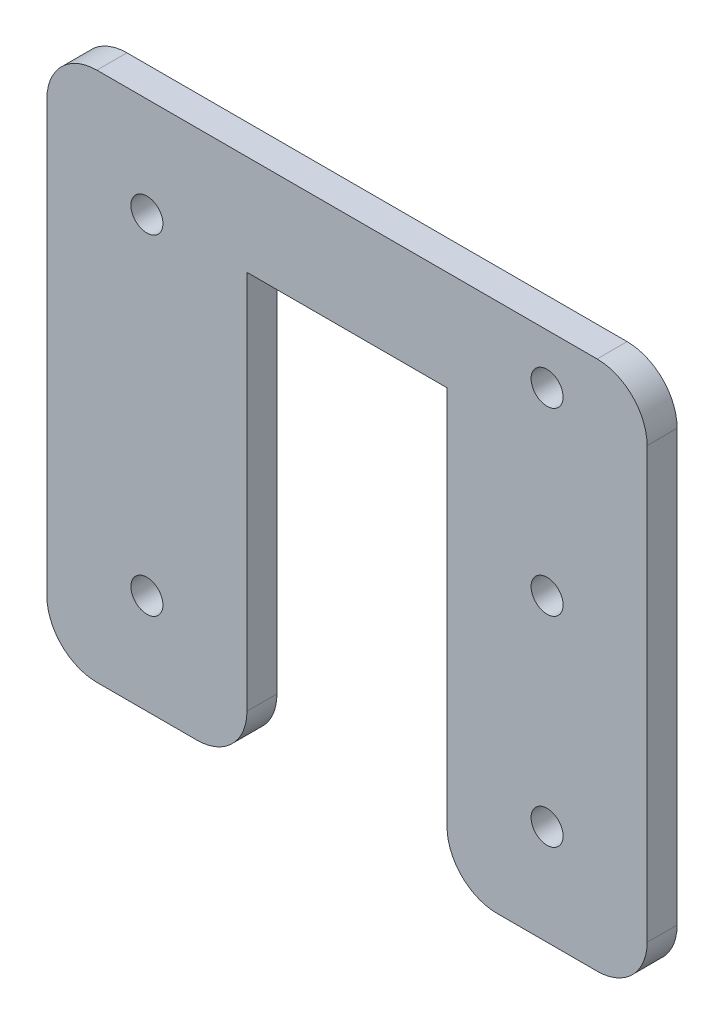
ISO-10303-21;
HEADER;
FILE_DESCRIPTION(('STEP AP214'),'2;1');
FILE_NAME('part.step','',(''),(''),'','','');
FILE_SCHEMA(('AUTOMOTIVE_DESIGN { 1 0 10303 214 1 1 1 1 }'));
ENDSEC;
DATA;
#1=APPLICATION_CONTEXT('core data for automotive mechanical design processes');
#2=APPLICATION_PROTOCOL_DEFINITION('international standard','automotive_design',2000,#1);
#3=PRODUCT_CONTEXT('',#1,'mechanical');
#4=PRODUCT('Part','Part','',(#3));
#5=PRODUCT_RELATED_PRODUCT_CATEGORY('part','',(#4));
#6=PRODUCT_DEFINITION_FORMATION('','',#4);
#7=PRODUCT_DEFINITION_CONTEXT('part definition',#1,'design');
#8=PRODUCT_DEFINITION('design','',#6,#7);
#9=PRODUCT_DEFINITION_SHAPE('','',#8);
#10=(LENGTH_UNIT() NAMED_UNIT(*) SI_UNIT(.MILLI.,.METRE.));
#11=(NAMED_UNIT(*) PLANE_ANGLE_UNIT() SI_UNIT($,.RADIAN.));
#12=(NAMED_UNIT(*) SI_UNIT($,.STERADIAN.) SOLID_ANGLE_UNIT());
#13=UNCERTAINTY_MEASURE_WITH_UNIT(LENGTH_MEASURE(1.E-05),#10,'distance_accuracy_value','');
#14=(GEOMETRIC_REPRESENTATION_CONTEXT(3) GLOBAL_UNCERTAINTY_ASSIGNED_CONTEXT((#13)) GLOBAL_UNIT_ASSIGNED_CONTEXT((#10,
#11,#12)) REPRESENTATION_CONTEXT('',''));
#15=CARTESIAN_POINT('',(0.,0.,0.));
#16=DIRECTION('',(0.,0.,1.));
#17=DIRECTION('',(1.,0.,0.));
#18=AXIS2_PLACEMENT_3D('',#15,#16,#17);
#19=CARTESIAN_POINT('',(0.,0.,3.));
#20=DIRECTION('',(0.,1.,0.));
#21=DIRECTION('',(0.,0.,1.));
#22=AXIS2_PLACEMENT_3D('',#19,#20,#21);
#23=PLANE('',#22);
#24=DIRECTION('',(1.,0.,0.));
#25=VECTOR('',#24,1.);
#26=CARTESIAN_POINT('',(0.,0.,3.));
#27=LINE('',#26,#25);
#28=CARTESIAN_POINT('',(5.,0.,3.));
#29=VERTEX_POINT('',#28);
#30=CARTESIAN_POINT('',(15.,0.,3.));
#31=VERTEX_POINT('',#30);
#32=EDGE_CURVE('E192',#29,#31,#27,.T.);
#33=ORIENTED_EDGE('',*,*,#32,.F.);
#34=DIRECTION('',(0.,0.,-1.));
#35=VECTOR('',#34,1.);
#36=CARTESIAN_POINT('',(5.,0.,3.));
#37=LINE('',#36,#35);
#38=CARTESIAN_POINT('',(5.,0.,0.));
#39=VERTEX_POINT('',#38);
#40=EDGE_CURVE('E210',#29,#39,#37,.T.);
#41=ORIENTED_EDGE('',*,*,#40,.T.);
#42=DIRECTION('',(1.,0.,0.));
#43=VECTOR('',#42,1.);
#44=CARTESIAN_POINT('',(0.,0.,0.));
#45=LINE('',#44,#43);
#46=CARTESIAN_POINT('',(15.,0.,0.));
#47=VERTEX_POINT('',#46);
#48=EDGE_CURVE('E203',#39,#47,#45,.T.);
#49=ORIENTED_EDGE('',*,*,#48,.T.);
#50=DIRECTION('',(0.,0.,1.));
#51=VECTOR('',#50,1.);
#52=CARTESIAN_POINT('',(15.,0.,3.));
#53=LINE('',#52,#51);
#54=EDGE_CURVE('E197',#47,#31,#53,.T.);
#55=ORIENTED_EDGE('',*,*,#54,.T.);
#56=EDGE_LOOP('',(#33,#41,#49,#55));
#57=FACE_BOUND('',#56,.T.);
#58=ADVANCED_FACE('F47',(#57),#23,.F.);
#59=CARTESIAN_POINT('',(0.,0.,3.));
#60=DIRECTION('',(1.,0.,0.));
#61=DIRECTION('',(0.,0.,-1.));
#62=AXIS2_PLACEMENT_3D('',#59,#60,#61);
#63=PLANE('',#62);
#64=DIRECTION('',(0.,-1.,0.));
#65=VECTOR('',#64,1.);
#66=CARTESIAN_POINT('',(0.,0.,0.));
#67=LINE('',#66,#65);
#68=CARTESIAN_POINT('',(0.,48.,0.));
#69=VERTEX_POINT('',#68);
#70=CARTESIAN_POINT('',(0.,5.,0.));
#71=VERTEX_POINT('',#70);
#72=EDGE_CURVE('E161',#69,#71,#67,.T.);
#73=ORIENTED_EDGE('',*,*,#72,.T.);
#74=DIRECTION('',(0.,0.,-1.));
#75=VECTOR('',#74,1.);
#76=CARTESIAN_POINT('',(0.,5.,3.));
#77=LINE('',#76,#75);
#78=CARTESIAN_POINT('',(0.,5.,3.));
#79=VERTEX_POINT('',#78);
#80=EDGE_CURVE('E228',#71,#79,#77,.F.);
#81=ORIENTED_EDGE('',*,*,#80,.T.);
#82=DIRECTION('',(0.,-1.,0.));
#83=VECTOR('',#82,1.);
#84=CARTESIAN_POINT('',(0.,0.,3.));
#85=LINE('',#84,#83);
#86=CARTESIAN_POINT('',(0.,48.,3.));
#87=VERTEX_POINT('',#86);
#88=EDGE_CURVE('E185',#87,#79,#85,.T.);
#89=ORIENTED_EDGE('',*,*,#88,.F.);
#90=DIRECTION('',(0.,0.,-1.));
#91=VECTOR('',#90,1.);
#92=CARTESIAN_POINT('',(0.,48.,3.));
#93=LINE('',#92,#91);
#94=EDGE_CURVE('E225',#87,#69,#93,.T.);
#95=ORIENTED_EDGE('',*,*,#94,.T.);
#96=EDGE_LOOP('',(#73,#81,#89,#95));
#97=FACE_BOUND('',#96,.T.);
#98=ADVANCED_FACE('F276',(#97),#63,.F.);
#99=CARTESIAN_POINT('',(45.,0.,0.));
#100=VERTEX_POINT('',#99);
#101=CARTESIAN_POINT('',(55.,0.,0.));
#102=VERTEX_POINT('',#101);
#103=EDGE_CURVE('E200',#100,#102,#45,.T.);
#104=ORIENTED_EDGE('',*,*,#103,.T.);
#105=DIRECTION('',(0.,0.,-1.));
#106=VECTOR('',#105,1.);
#107=CARTESIAN_POINT('',(55.,0.,3.));
#108=LINE('',#107,#106);
#109=CARTESIAN_POINT('',(55.,0.,3.));
#110=VERTEX_POINT('',#109);
#111=EDGE_CURVE('E252',#102,#110,#108,.F.);
#112=ORIENTED_EDGE('',*,*,#111,.T.);
#113=CARTESIAN_POINT('',(45.,0.,3.));
#114=VERTEX_POINT('',#113);
#115=EDGE_CURVE('E188',#114,#110,#27,.T.);
#116=ORIENTED_EDGE('',*,*,#115,.F.);
#117=DIRECTION('',(0.,0.,1.));
#118=VECTOR('',#117,1.);
#119=CARTESIAN_POINT('',(45.,0.,3.));
#120=LINE('',#119,#118);
#121=EDGE_CURVE('E250',#114,#100,#120,.F.);
#122=ORIENTED_EDGE('',*,*,#121,.T.);
#123=EDGE_LOOP('',(#104,#112,#116,#122));
#124=FACE_BOUND('',#123,.T.);
#125=ADVANCED_FACE('F298',(#124),#23,.F.);
#126=CARTESIAN_POINT('',(60.,0.,3.));
#127=DIRECTION('',(-1.,0.,0.));
#128=DIRECTION('',(0.,0.,1.));
#129=AXIS2_PLACEMENT_3D('',#126,#127,#128);
#130=PLANE('',#129);
#131=DIRECTION('',(0.,1.,0.));
#132=VECTOR('',#131,1.);
#133=CARTESIAN_POINT('',(60.,0.,0.));
#134=LINE('',#133,#132);
#135=CARTESIAN_POINT('',(60.,5.,0.));
#136=VERTEX_POINT('',#135);
#137=CARTESIAN_POINT('',(60.,48.,0.));
#138=VERTEX_POINT('',#137);
#139=EDGE_CURVE('E204',#136,#138,#134,.T.);
#140=ORIENTED_EDGE('',*,*,#139,.T.);
#141=DIRECTION('',(0.,0.,-1.));
#142=VECTOR('',#141,1.);
#143=CARTESIAN_POINT('',(60.,48.,3.));
#144=LINE('',#143,#142);
#145=CARTESIAN_POINT('',(60.,48.,3.));
#146=VERTEX_POINT('',#145);
#147=EDGE_CURVE('E248',#138,#146,#144,.F.);
#148=ORIENTED_EDGE('',*,*,#147,.T.);
#149=DIRECTION('',(0.,1.,0.));
#150=VECTOR('',#149,1.);
#151=CARTESIAN_POINT('',(60.,0.,3.));
#152=LINE('',#151,#150);
#153=CARTESIAN_POINT('',(60.,5.,3.));
#154=VERTEX_POINT('',#153);
#155=EDGE_CURVE('E193',#154,#146,#152,.T.);
#156=ORIENTED_EDGE('',*,*,#155,.F.);
#157=DIRECTION('',(0.,0.,-1.));
#158=VECTOR('',#157,1.);
#159=CARTESIAN_POINT('',(60.,5.,3.));
#160=LINE('',#159,#158);
#161=EDGE_CURVE('E245',#154,#136,#160,.T.);
#162=ORIENTED_EDGE('',*,*,#161,.T.);
#163=EDGE_LOOP('',(#140,#148,#156,#162));
#164=FACE_BOUND('',#163,.T.);
#165=ADVANCED_FACE('F289',(#164),#130,.F.);
#166=CARTESIAN_POINT('',(0.,53.,3.));
#167=DIRECTION('',(0.,-1.,0.));
#168=DIRECTION('',(0.,0.,-1.));
#169=AXIS2_PLACEMENT_3D('',#166,#167,#168);
#170=PLANE('',#169);
#171=DIRECTION('',(-1.,0.,0.));
#172=VECTOR('',#171,1.);
#173=CARTESIAN_POINT('',(0.,53.,3.));
#174=LINE('',#173,#172);
#175=CARTESIAN_POINT('',(55.,53.,3.));
#176=VERTEX_POINT('',#175);
#177=CARTESIAN_POINT('',(5.,53.,3.));
#178=VERTEX_POINT('',#177);
#179=EDGE_CURVE('E195',#176,#178,#174,.T.);
#180=ORIENTED_EDGE('',*,*,#179,.F.);
#181=DIRECTION('',(0.,0.,-1.));
#182=VECTOR('',#181,1.);
#183=CARTESIAN_POINT('',(55.,53.,3.));
#184=LINE('',#183,#182);
#185=CARTESIAN_POINT('',(55.,53.,0.));
#186=VERTEX_POINT('',#185);
#187=EDGE_CURVE('E242',#176,#186,#184,.T.);
#188=ORIENTED_EDGE('',*,*,#187,.T.);
#189=DIRECTION('',(-1.,0.,0.));
#190=VECTOR('',#189,1.);
#191=CARTESIAN_POINT('',(0.,53.,0.));
#192=LINE('',#191,#190);
#193=CARTESIAN_POINT('',(5.,53.,0.));
#194=VERTEX_POINT('',#193);
#195=EDGE_CURVE('E189',#186,#194,#192,.T.);
#196=ORIENTED_EDGE('',*,*,#195,.T.);
#197=DIRECTION('',(0.,0.,-1.));
#198=VECTOR('',#197,1.);
#199=CARTESIAN_POINT('',(5.,53.,3.));
#200=LINE('',#199,#198);
#201=EDGE_CURVE('E62',#194,#178,#200,.F.);
#202=ORIENTED_EDGE('',*,*,#201,.T.);
#203=EDGE_LOOP('',(#180,#188,#196,#202));
#204=FACE_BOUND('',#203,.T.);
#205=ADVANCED_FACE('F282',(#204),#170,.F.);
#206=CARTESIAN_POINT('',(0.,0.,3.));
#207=DIRECTION('',(0.,0.,-1.));
#208=DIRECTION('',(-1.,0.,0.));
#209=AXIS2_PLACEMENT_3D('',#206,#207,#208);
#210=PLANE('',#209);
#211=CARTESIAN_POINT('',(9.99999999999999,43.,3.));
#212=DIRECTION('',(0.,0.,1.));
#213=DIRECTION('',(1.,0.,0.));
#214=AXIS2_PLACEMENT_3D('',#211,#212,#213);
#215=CIRCLE('',#214,1.6);
#216=CARTESIAN_POINT('',(11.6,43.,3.));
#217=VERTEX_POINT('',#216);
#218=EDGE_CURVE('E365',#217,#217,#215,.T.);
#219=ORIENTED_EDGE('',*,*,#218,.F.);
#220=EDGE_LOOP('',(#219));
#221=FACE_BOUND('',#220,.T.);
#222=CARTESIAN_POINT('',(10.,10.,3.));
#223=DIRECTION('',(0.,0.,1.));
#224=DIRECTION('',(1.,0.,0.));
#225=AXIS2_PLACEMENT_3D('',#222,#223,#224);
#226=CIRCLE('',#225,1.6);
#227=CARTESIAN_POINT('',(11.6,10.,3.));
#228=VERTEX_POINT('',#227);
#229=EDGE_CURVE('E367',#228,#228,#226,.T.);
#230=ORIENTED_EDGE('',*,*,#229,.F.);
#231=EDGE_LOOP('',(#230));
#232=FACE_BOUND('',#231,.T.);
#233=CARTESIAN_POINT('',(50.,10.,3.));
#234=DIRECTION('',(0.,0.,1.));
#235=DIRECTION('',(1.,0.,0.));
#236=AXIS2_PLACEMENT_3D('',#233,#234,#235);
#237=CIRCLE('',#236,1.6);
#238=CARTESIAN_POINT('',(51.6,10.,3.));
#239=VERTEX_POINT('',#238);
#240=EDGE_CURVE('E378',#239,#239,#237,.T.);
#241=ORIENTED_EDGE('',*,*,#240,.F.);
#242=EDGE_LOOP('',(#241));
#243=FACE_BOUND('',#242,.T.);
#244=CARTESIAN_POINT('',(50.,30.,3.));
#245=DIRECTION('',(0.,0.,1.));
#246=DIRECTION('',(1.,0.,0.));
#247=AXIS2_PLACEMENT_3D('',#244,#245,#246);
#248=CIRCLE('',#247,1.6);
#249=CARTESIAN_POINT('',(51.6,30.,3.));
#250=VERTEX_POINT('',#249);
#251=EDGE_CURVE('E381',#250,#250,#248,.T.);
#252=ORIENTED_EDGE('',*,*,#251,.F.);
#253=EDGE_LOOP('',(#252));
#254=FACE_BOUND('',#253,.T.);
#255=CARTESIAN_POINT('',(50.,48.,3.));
#256=DIRECTION('',(0.,0.,1.));
#257=DIRECTION('',(1.,0.,0.));
#258=AXIS2_PLACEMENT_3D('',#255,#256,#257);
#259=CIRCLE('',#258,1.6);
#260=CARTESIAN_POINT('',(51.6,48.,3.));
#261=VERTEX_POINT('',#260);
#262=EDGE_CURVE('E387',#261,#261,#259,.T.);
#263=ORIENTED_EDGE('',*,*,#262,.F.);
#264=EDGE_LOOP('',(#263));
#265=FACE_BOUND('',#264,.T.);
#266=ORIENTED_EDGE('',*,*,#88,.T.);
#267=CARTESIAN_POINT('',(5.,5.,3.));
#268=DIRECTION('',(0.,0.,-1.));
#269=DIRECTION('',(-1.,0.,0.));
#270=AXIS2_PLACEMENT_3D('',#267,#268,#269);
#271=CIRCLE('',#270,5.);
#272=EDGE_CURVE('E239',#79,#29,#271,.F.);
#273=ORIENTED_EDGE('',*,*,#272,.T.);
#274=ORIENTED_EDGE('',*,*,#32,.T.);
#275=CARTESIAN_POINT('',(15.,5.,3.));
#276=DIRECTION('',(0.,0.,-1.));
#277=DIRECTION('',(-1.,0.,0.));
#278=AXIS2_PLACEMENT_3D('',#275,#276,#277);
#279=CIRCLE('',#278,5.);
#280=CARTESIAN_POINT('',(20.,5.,3.));
#281=VERTEX_POINT('',#280);
#282=EDGE_CURVE('E232',#31,#281,#279,.F.);
#283=ORIENTED_EDGE('',*,*,#282,.T.);
#284=DIRECTION('',(0.,-1.,0.));
#285=VECTOR('',#284,1.);
#286=CARTESIAN_POINT('',(20.,0.,3.));
#287=LINE('',#286,#285);
#288=CARTESIAN_POINT('',(20.,43.,3.));
#289=VERTEX_POINT('',#288);
#290=EDGE_CURVE('E179',#289,#281,#287,.T.);
#291=ORIENTED_EDGE('',*,*,#290,.F.);
#292=DIRECTION('',(-1.,0.,0.));
#293=VECTOR('',#292,1.);
#294=CARTESIAN_POINT('',(20.,43.,3.));
#295=LINE('',#294,#293);
#296=CARTESIAN_POINT('',(40.,43.,3.));
#297=VERTEX_POINT('',#296);
#298=EDGE_CURVE('E157',#297,#289,#295,.T.);
#299=ORIENTED_EDGE('',*,*,#298,.F.);
#300=DIRECTION('',(0.,1.,0.));
#301=VECTOR('',#300,1.);
#302=CARTESIAN_POINT('',(40.,0.,3.));
#303=LINE('',#302,#301);
#304=CARTESIAN_POINT('',(40.,5.,3.));
#305=VERTEX_POINT('',#304);
#306=EDGE_CURVE('E181',#305,#297,#303,.T.);
#307=ORIENTED_EDGE('',*,*,#306,.F.);
#308=CARTESIAN_POINT('',(45.,5.,3.));
#309=DIRECTION('',(0.,0.,-1.));
#310=DIRECTION('',(-1.,0.,0.));
#311=AXIS2_PLACEMENT_3D('',#308,#309,#310);
#312=CIRCLE('',#311,5.);
#313=EDGE_CURVE('E234',#305,#114,#312,.F.);
#314=ORIENTED_EDGE('',*,*,#313,.T.);
#315=ORIENTED_EDGE('',*,*,#115,.T.);
#316=CARTESIAN_POINT('',(55.,5.,3.));
#317=DIRECTION('',(0.,0.,-1.));
#318=DIRECTION('',(-1.,0.,0.));
#319=AXIS2_PLACEMENT_3D('',#316,#317,#318);
#320=CIRCLE('',#319,5.);
#321=EDGE_CURVE('E236',#110,#154,#320,.F.);
#322=ORIENTED_EDGE('',*,*,#321,.T.);
#323=ORIENTED_EDGE('',*,*,#155,.T.);
#324=CARTESIAN_POINT('',(55.,48.,3.));
#325=DIRECTION('',(0.,0.,-1.));
#326=DIRECTION('',(-1.,0.,0.));
#327=AXIS2_PLACEMENT_3D('',#324,#325,#326);
#328=CIRCLE('',#327,5.);
#329=EDGE_CURVE('E69',#146,#176,#328,.F.);
#330=ORIENTED_EDGE('',*,*,#329,.T.);
#331=ORIENTED_EDGE('',*,*,#179,.T.);
#332=CARTESIAN_POINT('',(5.,48.,3.));
#333=DIRECTION('',(0.,0.,-1.));
#334=DIRECTION('',(-1.,0.,0.));
#335=AXIS2_PLACEMENT_3D('',#332,#333,#334);
#336=CIRCLE('',#335,5.);
#337=EDGE_CURVE('E230',#178,#87,#336,.F.);
#338=ORIENTED_EDGE('',*,*,#337,.T.);
#339=EDGE_LOOP('',(#266,#273,#274,#283,#291,#299,#307,#314,#315,#322,#323,#330,#331,#338));
#340=FACE_BOUND('',#339,.T.);
#341=ADVANCED_FACE('F260',(#221,#232,#243,#254,#265,#340),#210,.F.);
#342=CARTESIAN_POINT('',(0.,0.,0.));
#343=DIRECTION('',(0.,0.,-1.));
#344=DIRECTION('',(-1.,0.,0.));
#345=AXIS2_PLACEMENT_3D('',#342,#343,#344);
#346=PLANE('',#345);
#347=CARTESIAN_POINT('',(9.99999999999999,43.,0.));
#348=DIRECTION('',(0.,0.,1.));
#349=DIRECTION('',(1.,0.,0.));
#350=AXIS2_PLACEMENT_3D('',#347,#348,#349);
#351=CIRCLE('',#350,1.6);
#352=CARTESIAN_POINT('',(11.6,43.,0.));
#353=VERTEX_POINT('',#352);
#354=EDGE_CURVE('E362',#353,#353,#351,.T.);
#355=ORIENTED_EDGE('',*,*,#354,.T.);
#356=EDGE_LOOP('',(#355));
#357=FACE_BOUND('',#356,.T.);
#358=CARTESIAN_POINT('',(10.,10.,0.));
#359=DIRECTION('',(0.,0.,1.));
#360=DIRECTION('',(1.,0.,0.));
#361=AXIS2_PLACEMENT_3D('',#358,#359,#360);
#362=CIRCLE('',#361,1.6);
#363=CARTESIAN_POINT('',(11.6,10.,0.));
#364=VERTEX_POINT('',#363);
#365=EDGE_CURVE('E370',#364,#364,#362,.T.);
#366=ORIENTED_EDGE('',*,*,#365,.T.);
#367=EDGE_LOOP('',(#366));
#368=FACE_BOUND('',#367,.T.);
#369=CARTESIAN_POINT('',(50.,10.,0.));
#370=DIRECTION('',(0.,0.,1.));
#371=DIRECTION('',(1.,0.,0.));
#372=AXIS2_PLACEMENT_3D('',#369,#370,#371);
#373=CIRCLE('',#372,1.6);
#374=CARTESIAN_POINT('',(51.6,10.,0.));
#375=VERTEX_POINT('',#374);
#376=EDGE_CURVE('E182',#375,#375,#373,.T.);
#377=ORIENTED_EDGE('',*,*,#376,.T.);
#378=EDGE_LOOP('',(#377));
#379=FACE_BOUND('',#378,.T.);
#380=CARTESIAN_POINT('',(50.,30.,0.));
#381=DIRECTION('',(0.,0.,1.));
#382=DIRECTION('',(1.,0.,0.));
#383=AXIS2_PLACEMENT_3D('',#380,#381,#382);
#384=CIRCLE('',#383,1.6);
#385=CARTESIAN_POINT('',(51.6,30.,0.));
#386=VERTEX_POINT('',#385);
#387=EDGE_CURVE('E384',#386,#386,#384,.T.);
#388=ORIENTED_EDGE('',*,*,#387,.T.);
#389=EDGE_LOOP('',(#388));
#390=FACE_BOUND('',#389,.T.);
#391=CARTESIAN_POINT('',(50.,48.,0.));
#392=DIRECTION('',(0.,0.,1.));
#393=DIRECTION('',(1.,0.,0.));
#394=AXIS2_PLACEMENT_3D('',#391,#392,#393);
#395=CIRCLE('',#394,1.6);
#396=CARTESIAN_POINT('',(51.6,48.,0.));
#397=VERTEX_POINT('',#396);
#398=EDGE_CURVE('E373',#397,#397,#395,.T.);
#399=ORIENTED_EDGE('',*,*,#398,.T.);
#400=EDGE_LOOP('',(#399));
#401=FACE_BOUND('',#400,.T.);
#402=ORIENTED_EDGE('',*,*,#48,.F.);
#403=CARTESIAN_POINT('',(5.,5.,0.));
#404=DIRECTION('',(0.,0.,-1.));
#405=DIRECTION('',(-1.,0.,0.));
#406=AXIS2_PLACEMENT_3D('',#403,#404,#405);
#407=CIRCLE('',#406,5.);
#408=EDGE_CURVE('E223',#39,#71,#407,.T.);
#409=ORIENTED_EDGE('',*,*,#408,.T.);
#410=ORIENTED_EDGE('',*,*,#72,.F.);
#411=CARTESIAN_POINT('',(5.,48.,0.));
#412=DIRECTION('',(0.,0.,-1.));
#413=DIRECTION('',(-1.,0.,0.));
#414=AXIS2_PLACEMENT_3D('',#411,#412,#413);
#415=CIRCLE('',#414,5.);
#416=EDGE_CURVE('E213',#69,#194,#415,.T.);
#417=ORIENTED_EDGE('',*,*,#416,.T.);
#418=ORIENTED_EDGE('',*,*,#195,.F.);
#419=CARTESIAN_POINT('',(55.,48.,0.));
#420=DIRECTION('',(0.,0.,-1.));
#421=DIRECTION('',(-1.,0.,0.));
#422=AXIS2_PLACEMENT_3D('',#419,#420,#421);
#423=CIRCLE('',#422,5.);
#424=EDGE_CURVE('E221',#186,#138,#423,.T.);
#425=ORIENTED_EDGE('',*,*,#424,.T.);
#426=ORIENTED_EDGE('',*,*,#139,.F.);
#427=CARTESIAN_POINT('',(55.,5.,0.));
#428=DIRECTION('',(0.,0.,-1.));
#429=DIRECTION('',(-1.,0.,0.));
#430=AXIS2_PLACEMENT_3D('',#427,#428,#429);
#431=CIRCLE('',#430,5.);
#432=EDGE_CURVE('E219',#136,#102,#431,.T.);
#433=ORIENTED_EDGE('',*,*,#432,.T.);
#434=ORIENTED_EDGE('',*,*,#103,.F.);
#435=CARTESIAN_POINT('',(45.,5.,0.));
#436=DIRECTION('',(0.,0.,-1.));
#437=DIRECTION('',(-1.,0.,0.));
#438=AXIS2_PLACEMENT_3D('',#435,#436,#437);
#439=CIRCLE('',#438,5.);
#440=CARTESIAN_POINT('',(40.,5.,0.));
#441=VERTEX_POINT('',#440);
#442=EDGE_CURVE('E217',#100,#441,#439,.T.);
#443=ORIENTED_EDGE('',*,*,#442,.T.);
#444=DIRECTION('',(0.,1.,0.));
#445=VECTOR('',#444,1.);
#446=CARTESIAN_POINT('',(40.,0.,0.));
#447=LINE('',#446,#445);
#448=CARTESIAN_POINT('',(40.,43.,0.));
#449=VERTEX_POINT('',#448);
#450=EDGE_CURVE('E170',#441,#449,#447,.T.);
#451=ORIENTED_EDGE('',*,*,#450,.T.);
#452=DIRECTION('',(-1.,0.,0.));
#453=VECTOR('',#452,1.);
#454=CARTESIAN_POINT('',(20.,43.,0.));
#455=LINE('',#454,#453);
#456=CARTESIAN_POINT('',(20.,43.,0.));
#457=VERTEX_POINT('',#456);
#458=EDGE_CURVE('E154',#449,#457,#455,.T.);
#459=ORIENTED_EDGE('',*,*,#458,.T.);
#460=DIRECTION('',(0.,-1.,0.));
#461=VECTOR('',#460,1.);
#462=CARTESIAN_POINT('',(20.,0.,0.));
#463=LINE('',#462,#461);
#464=CARTESIAN_POINT('',(20.,5.,0.));
#465=VERTEX_POINT('',#464);
#466=EDGE_CURVE('E165',#457,#465,#463,.T.);
#467=ORIENTED_EDGE('',*,*,#466,.T.);
#468=CARTESIAN_POINT('',(15.,5.,0.));
#469=DIRECTION('',(0.,0.,-1.));
#470=DIRECTION('',(-1.,0.,0.));
#471=AXIS2_PLACEMENT_3D('',#468,#469,#470);
#472=CIRCLE('',#471,5.);
#473=EDGE_CURVE('E215',#465,#47,#472,.T.);
#474=ORIENTED_EDGE('',*,*,#473,.T.);
#475=EDGE_LOOP('',(#402,#409,#410,#417,#418,#425,#426,#433,#434,#443,#451,#459,#467,#474));
#476=FACE_BOUND('',#475,.T.);
#477=ADVANCED_FACE('F173',(#357,#368,#379,#390,#401,#476),#346,.T.);
#478=CARTESIAN_POINT('',(20.,0.,0.));
#479=DIRECTION('',(-1.,0.,0.));
#480=DIRECTION('',(0.,0.,1.));
#481=AXIS2_PLACEMENT_3D('',#478,#479,#480);
#482=PLANE('',#481);
#483=ORIENTED_EDGE('',*,*,#290,.T.);
#484=DIRECTION('',(0.,0.,1.));
#485=VECTOR('',#484,1.);
#486=CARTESIAN_POINT('',(20.,5.,0.));
#487=LINE('',#486,#485);
#488=EDGE_CURVE('E11',#281,#465,#487,.F.);
#489=ORIENTED_EDGE('',*,*,#488,.T.);
#490=ORIENTED_EDGE('',*,*,#466,.F.);
#491=DIRECTION('',(0.,0.,1.));
#492=VECTOR('',#491,1.);
#493=CARTESIAN_POINT('',(20.,43.,0.));
#494=LINE('',#493,#492);
#495=EDGE_CURVE('E149',#457,#289,#494,.T.);
#496=ORIENTED_EDGE('',*,*,#495,.T.);
#497=EDGE_LOOP('',(#483,#489,#490,#496));
#498=FACE_BOUND('',#497,.T.);
#499=ADVANCED_FACE('F166',(#498),#482,.F.);
#500=CARTESIAN_POINT('',(20.,43.,0.));
#501=DIRECTION('',(0.,1.,0.));
#502=DIRECTION('',(0.,0.,1.));
#503=AXIS2_PLACEMENT_3D('',#500,#501,#502);
#504=PLANE('',#503);
#505=ORIENTED_EDGE('',*,*,#298,.T.);
#506=ORIENTED_EDGE('',*,*,#495,.F.);
#507=ORIENTED_EDGE('',*,*,#458,.F.);
#508=DIRECTION('',(0.,0.,1.));
#509=VECTOR('',#508,1.);
#510=CARTESIAN_POINT('',(40.,43.,0.));
#511=LINE('',#510,#509);
#512=EDGE_CURVE('E162',#449,#297,#511,.T.);
#513=ORIENTED_EDGE('',*,*,#512,.T.);
#514=EDGE_LOOP('',(#505,#506,#507,#513));
#515=FACE_BOUND('',#514,.T.);
#516=ADVANCED_FACE('F151',(#515),#504,.F.);
#517=CARTESIAN_POINT('',(40.,0.,0.));
#518=DIRECTION('',(1.,0.,0.));
#519=DIRECTION('',(0.,0.,-1.));
#520=AXIS2_PLACEMENT_3D('',#517,#518,#519);
#521=PLANE('',#520);
#522=ORIENTED_EDGE('',*,*,#450,.F.);
#523=DIRECTION('',(0.,0.,1.));
#524=VECTOR('',#523,1.);
#525=CARTESIAN_POINT('',(40.,5.,0.));
#526=LINE('',#525,#524);
#527=EDGE_CURVE('E55',#441,#305,#526,.T.);
#528=ORIENTED_EDGE('',*,*,#527,.T.);
#529=ORIENTED_EDGE('',*,*,#306,.T.);
#530=ORIENTED_EDGE('',*,*,#512,.F.);
#531=EDGE_LOOP('',(#522,#528,#529,#530));
#532=FACE_BOUND('',#531,.T.);
#533=ADVANCED_FACE('F257',(#532),#521,.F.);
#534=CARTESIAN_POINT('',(50.,48.,0.));
#535=DIRECTION('',(0.,0.,1.));
#536=DIRECTION('',(1.,0.,0.));
#537=AXIS2_PLACEMENT_3D('',#534,#535,#536);
#538=CYLINDRICAL_SURFACE('',#537,1.6);
#539=ORIENTED_EDGE('',*,*,#398,.F.);
#540=EDGE_LOOP('',(#539));
#541=FACE_BOUND('',#540,.T.);
#542=ORIENTED_EDGE('',*,*,#262,.T.);
#543=EDGE_LOOP('',(#542));
#544=FACE_BOUND('',#543,.T.);
#545=ADVANCED_FACE('F336',(#541,#544),#538,.F.);
#546=CARTESIAN_POINT('',(50.,30.,0.));
#547=DIRECTION('',(0.,0.,1.));
#548=DIRECTION('',(1.,0.,0.));
#549=AXIS2_PLACEMENT_3D('',#546,#547,#548);
#550=CYLINDRICAL_SURFACE('',#549,1.6);
#551=ORIENTED_EDGE('',*,*,#387,.F.);
#552=EDGE_LOOP('',(#551));
#553=FACE_BOUND('',#552,.T.);
#554=ORIENTED_EDGE('',*,*,#251,.T.);
#555=EDGE_LOOP('',(#554));
#556=FACE_BOUND('',#555,.T.);
#557=ADVANCED_FACE('F341',(#553,#556),#550,.F.);
#558=CARTESIAN_POINT('',(50.,10.,0.));
#559=DIRECTION('',(0.,0.,1.));
#560=DIRECTION('',(1.,0.,0.));
#561=AXIS2_PLACEMENT_3D('',#558,#559,#560);
#562=CYLINDRICAL_SURFACE('',#561,1.6);
#563=ORIENTED_EDGE('',*,*,#376,.F.);
#564=EDGE_LOOP('',(#563));
#565=FACE_BOUND('',#564,.T.);
#566=ORIENTED_EDGE('',*,*,#240,.T.);
#567=EDGE_LOOP('',(#566));
#568=FACE_BOUND('',#567,.T.);
#569=ADVANCED_FACE('F345',(#565,#568),#562,.F.);
#570=CARTESIAN_POINT('',(10.,10.,0.));
#571=DIRECTION('',(0.,0.,1.));
#572=DIRECTION('',(1.,0.,0.));
#573=AXIS2_PLACEMENT_3D('',#570,#571,#572);
#574=CYLINDRICAL_SURFACE('',#573,1.6);
#575=ORIENTED_EDGE('',*,*,#365,.F.);
#576=EDGE_LOOP('',(#575));
#577=FACE_BOUND('',#576,.T.);
#578=ORIENTED_EDGE('',*,*,#229,.T.);
#579=EDGE_LOOP('',(#578));
#580=FACE_BOUND('',#579,.T.);
#581=ADVANCED_FACE('F349',(#577,#580),#574,.F.);
#582=CARTESIAN_POINT('',(5.,5.,3.));
#583=DIRECTION('',(0.,0.,-1.));
#584=DIRECTION('',(-1.,0.,0.));
#585=AXIS2_PLACEMENT_3D('',#582,#583,#584);
#586=CYLINDRICAL_SURFACE('',#585,5.);
#587=ORIENTED_EDGE('',*,*,#272,.F.);
#588=ORIENTED_EDGE('',*,*,#80,.F.);
#589=ORIENTED_EDGE('',*,*,#408,.F.);
#590=ORIENTED_EDGE('',*,*,#40,.F.);
#591=EDGE_LOOP('',(#587,#588,#589,#590));
#592=FACE_BOUND('',#591,.T.);
#593=ADVANCED_FACE('F272',(#592),#586,.T.);
#594=CARTESIAN_POINT('',(55.,48.,3.));
#595=DIRECTION('',(0.,0.,-1.));
#596=DIRECTION('',(-1.,0.,0.));
#597=AXIS2_PLACEMENT_3D('',#594,#595,#596);
#598=CYLINDRICAL_SURFACE('',#597,5.);
#599=ORIENTED_EDGE('',*,*,#329,.F.);
#600=ORIENTED_EDGE('',*,*,#147,.F.);
#601=ORIENTED_EDGE('',*,*,#424,.F.);
#602=ORIENTED_EDGE('',*,*,#187,.F.);
#603=EDGE_LOOP('',(#599,#600,#601,#602));
#604=FACE_BOUND('',#603,.T.);
#605=ADVANCED_FACE('F285',(#604),#598,.T.);
#606=CARTESIAN_POINT('',(55.,5.,3.));
#607=DIRECTION('',(0.,0.,-1.));
#608=DIRECTION('',(-1.,0.,0.));
#609=AXIS2_PLACEMENT_3D('',#606,#607,#608);
#610=CYLINDRICAL_SURFACE('',#609,5.);
#611=ORIENTED_EDGE('',*,*,#321,.F.);
#612=ORIENTED_EDGE('',*,*,#111,.F.);
#613=ORIENTED_EDGE('',*,*,#432,.F.);
#614=ORIENTED_EDGE('',*,*,#161,.F.);
#615=EDGE_LOOP('',(#611,#612,#613,#614));
#616=FACE_BOUND('',#615,.T.);
#617=ADVANCED_FACE('F294',(#616),#610,.T.);
#618=CARTESIAN_POINT('',(45.,5.,0.));
#619=DIRECTION('',(0.,0.,1.));
#620=DIRECTION('',(1.,0.,0.));
#621=AXIS2_PLACEMENT_3D('',#618,#619,#620);
#622=CYLINDRICAL_SURFACE('',#621,5.);
#623=ORIENTED_EDGE('',*,*,#442,.F.);
#624=ORIENTED_EDGE('',*,*,#121,.F.);
#625=ORIENTED_EDGE('',*,*,#313,.F.);
#626=ORIENTED_EDGE('',*,*,#527,.F.);
#627=EDGE_LOOP('',(#623,#624,#625,#626));
#628=FACE_BOUND('',#627,.T.);
#629=ADVANCED_FACE('F300',(#628),#622,.T.);
#630=CARTESIAN_POINT('',(15.,5.,3.));
#631=DIRECTION('',(0.,0.,1.));
#632=DIRECTION('',(1.,0.,0.));
#633=AXIS2_PLACEMENT_3D('',#630,#631,#632);
#634=CYLINDRICAL_SURFACE('',#633,5.);
#635=ORIENTED_EDGE('',*,*,#473,.F.);
#636=ORIENTED_EDGE('',*,*,#488,.F.);
#637=ORIENTED_EDGE('',*,*,#282,.F.);
#638=ORIENTED_EDGE('',*,*,#54,.F.);
#639=EDGE_LOOP('',(#635,#636,#637,#638));
#640=FACE_BOUND('',#639,.T.);
#641=ADVANCED_FACE('F264',(#640),#634,.T.);
#642=CARTESIAN_POINT('',(5.,48.,3.));
#643=DIRECTION('',(0.,0.,-1.));
#644=DIRECTION('',(-1.,0.,0.));
#645=AXIS2_PLACEMENT_3D('',#642,#643,#644);
#646=CYLINDRICAL_SURFACE('',#645,5.);
#647=ORIENTED_EDGE('',*,*,#337,.F.);
#648=ORIENTED_EDGE('',*,*,#201,.F.);
#649=ORIENTED_EDGE('',*,*,#416,.F.);
#650=ORIENTED_EDGE('',*,*,#94,.F.);
#651=EDGE_LOOP('',(#647,#648,#649,#650));
#652=FACE_BOUND('',#651,.T.);
#653=ADVANCED_FACE('F49',(#652),#646,.T.);
#654=CARTESIAN_POINT('',(9.99999999999999,43.,0.));
#655=DIRECTION('',(0.,0.,1.));
#656=DIRECTION('',(1.,0.,0.));
#657=AXIS2_PLACEMENT_3D('',#654,#655,#656);
#658=CYLINDRICAL_SURFACE('',#657,1.6);
#659=ORIENTED_EDGE('',*,*,#354,.F.);
#660=EDGE_LOOP('',(#659));
#661=FACE_BOUND('',#660,.T.);
#662=ORIENTED_EDGE('',*,*,#218,.T.);
#663=EDGE_LOOP('',(#662));
#664=FACE_BOUND('',#663,.T.);
#665=ADVANCED_FACE('F353',(#661,#664),#658,.F.);
#666=CLOSED_SHELL('',(#58,#98,#125,#165,#205,#341,#477,#499,#516,#533,#545,#557,#569,#581,#593,
#605,#617,#629,#641,#653,#665));
#667=MANIFOLD_SOLID_BREP('B2',#666);
#668=ADVANCED_BREP_SHAPE_REPRESENTATION('',(#18,#667),#14);
#669=SHAPE_DEFINITION_REPRESENTATION(#9,#668);
ENDSEC;
END-ISO-10303-21;
